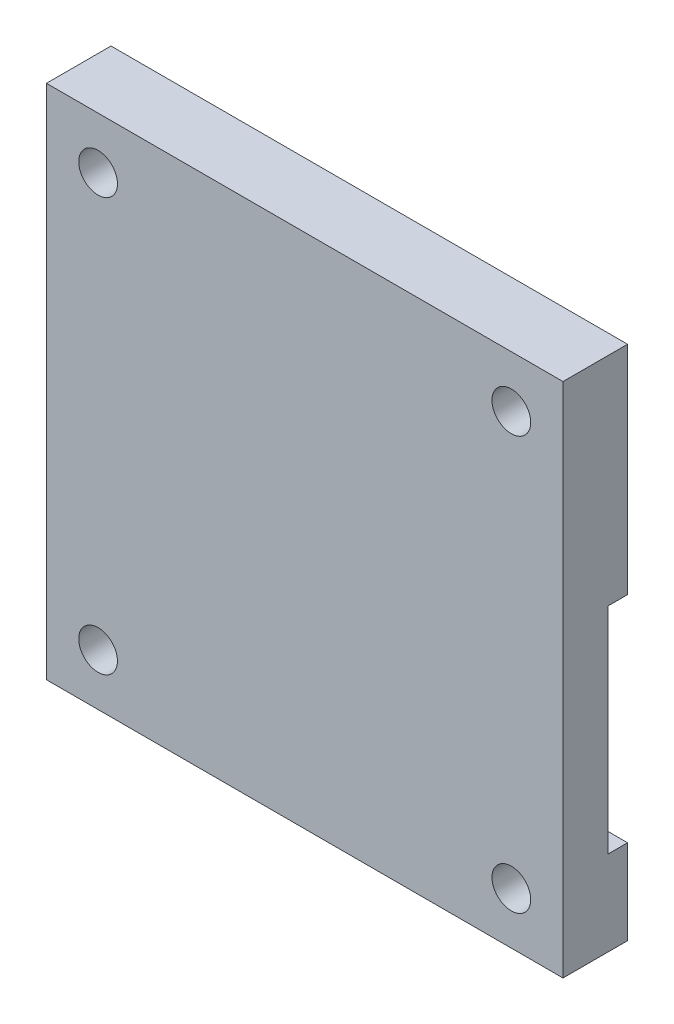
ISO-10303-21;
HEADER;
FILE_DESCRIPTION(('STEP AP214'),'2;1');
FILE_NAME('part.step','',(''),(''),'','','');
FILE_SCHEMA(('AUTOMOTIVE_DESIGN { 1 0 10303 214 1 1 1 1 }'));
ENDSEC;
DATA;
#1=APPLICATION_CONTEXT('core data for automotive mechanical design processes');
#2=APPLICATION_PROTOCOL_DEFINITION('international standard','automotive_design',2000,#1);
#3=PRODUCT_CONTEXT('',#1,'mechanical');
#4=PRODUCT('Part','Part','',(#3));
#5=PRODUCT_RELATED_PRODUCT_CATEGORY('part','',(#4));
#6=PRODUCT_DEFINITION_FORMATION('','',#4);
#7=PRODUCT_DEFINITION_CONTEXT('part definition',#1,'design');
#8=PRODUCT_DEFINITION('design','',#6,#7);
#9=PRODUCT_DEFINITION_SHAPE('','',#8);
#10=(LENGTH_UNIT() NAMED_UNIT(*) SI_UNIT(.MILLI.,.METRE.));
#11=(NAMED_UNIT(*) PLANE_ANGLE_UNIT() SI_UNIT($,.RADIAN.));
#12=(NAMED_UNIT(*) SI_UNIT($,.STERADIAN.) SOLID_ANGLE_UNIT());
#13=UNCERTAINTY_MEASURE_WITH_UNIT(LENGTH_MEASURE(1.E-05),#10,'distance_accuracy_value','');
#14=(GEOMETRIC_REPRESENTATION_CONTEXT(3) GLOBAL_UNCERTAINTY_ASSIGNED_CONTEXT((#13)) GLOBAL_UNIT_ASSIGNED_CONTEXT((#10,
#11,#12)) REPRESENTATION_CONTEXT('',''));
#15=CARTESIAN_POINT('',(0.,0.,0.));
#16=DIRECTION('',(0.,0.,1.));
#17=DIRECTION('',(1.,0.,0.));
#18=AXIS2_PLACEMENT_3D('',#15,#16,#17);
#19=CARTESIAN_POINT('',(0.,0.,0.));
#20=DIRECTION('',(0.,0.,1.));
#21=DIRECTION('',(1.,0.,0.));
#22=AXIS2_PLACEMENT_3D('',#19,#20,#21);
#23=PLANE('',#22);
#24=CARTESIAN_POINT('',(16.,16.,0.));
#25=DIRECTION('',(0.,0.,1.));
#26=DIRECTION('',(1.,0.,0.));
#27=AXIS2_PLACEMENT_3D('',#24,#25,#26);
#28=CIRCLE('',#27,1.5);
#29=CARTESIAN_POINT('',(17.5,16.,0.));
#30=VERTEX_POINT('',#29);
#31=EDGE_CURVE('E174',#30,#30,#28,.T.);
#32=ORIENTED_EDGE('',*,*,#31,.T.);
#33=EDGE_LOOP('',(#32));
#34=FACE_BOUND('',#33,.T.);
#35=CARTESIAN_POINT('',(-16.,16.,0.));
#36=DIRECTION('',(0.,0.,1.));
#37=DIRECTION('',(1.,0.,0.));
#38=AXIS2_PLACEMENT_3D('',#35,#36,#37);
#39=CIRCLE('',#38,1.5);
#40=CARTESIAN_POINT('',(-14.5,16.,0.));
#41=VERTEX_POINT('',#40);
#42=EDGE_CURVE('E182',#41,#41,#39,.T.);
#43=ORIENTED_EDGE('',*,*,#42,.T.);
#44=EDGE_LOOP('',(#43));
#45=FACE_BOUND('',#44,.T.);
#46=DIRECTION('',(0.,1.,0.));
#47=VECTOR('',#46,1.);
#48=CARTESIAN_POINT('',(20.,-20.,0.));
#49=LINE('',#48,#47);
#50=CARTESIAN_POINT('',(20.,3.20605328460744,0.));
#51=VERTEX_POINT('',#50);
#52=CARTESIAN_POINT('',(20.,20.,0.));
#53=VERTEX_POINT('',#52);
#54=EDGE_CURVE('E212',#51,#53,#49,.T.);
#55=ORIENTED_EDGE('',*,*,#54,.F.);
#56=DIRECTION('',(1.,0.,0.));
#57=VECTOR('',#56,1.);
#58=CARTESIAN_POINT('',(20.,3.20605328460744,0.));
#59=LINE('',#58,#57);
#60=CARTESIAN_POINT('',(-20.,3.20605328460744,0.));
#61=VERTEX_POINT('',#60);
#62=EDGE_CURVE('E142',#61,#51,#59,.T.);
#63=ORIENTED_EDGE('',*,*,#62,.F.);
#64=DIRECTION('',(0.,-1.,0.));
#65=VECTOR('',#64,1.);
#66=CARTESIAN_POINT('',(-20.,-20.,0.));
#67=LINE('',#66,#65);
#68=CARTESIAN_POINT('',(-20.,20.,0.));
#69=VERTEX_POINT('',#68);
#70=EDGE_CURVE('E205',#69,#61,#67,.T.);
#71=ORIENTED_EDGE('',*,*,#70,.F.);
#72=DIRECTION('',(-1.,0.,0.));
#73=VECTOR('',#72,1.);
#74=CARTESIAN_POINT('',(20.,20.,0.));
#75=LINE('',#74,#73);
#76=EDGE_CURVE('E90',#53,#69,#75,.T.);
#77=ORIENTED_EDGE('',*,*,#76,.F.);
#78=EDGE_LOOP('',(#55,#63,#71,#77));
#79=FACE_BOUND('',#78,.T.);
#80=ADVANCED_FACE('F39',(#34,#45,#79),#23,.F.);
#81=CARTESIAN_POINT('',(0.,0.,5.));
#82=DIRECTION('',(0.,0.,1.));
#83=DIRECTION('',(1.,0.,0.));
#84=AXIS2_PLACEMENT_3D('',#81,#82,#83);
#85=PLANE('',#84);
#86=CARTESIAN_POINT('',(-16.,-16.,5.));
#87=DIRECTION('',(0.,0.,1.));
#88=DIRECTION('',(1.,0.,0.));
#89=AXIS2_PLACEMENT_3D('',#86,#87,#88);
#90=CIRCLE('',#89,1.5);
#91=CARTESIAN_POINT('',(-14.5,-16.,5.));
#92=VERTEX_POINT('',#91);
#93=EDGE_CURVE('E170',#92,#92,#90,.T.);
#94=ORIENTED_EDGE('',*,*,#93,.F.);
#95=EDGE_LOOP('',(#94));
#96=FACE_BOUND('',#95,.T.);
#97=CARTESIAN_POINT('',(-16.,16.,5.));
#98=DIRECTION('',(0.,0.,1.));
#99=DIRECTION('',(1.,0.,0.));
#100=AXIS2_PLACEMENT_3D('',#97,#98,#99);
#101=CIRCLE('',#100,1.5);
#102=CARTESIAN_POINT('',(-14.5,16.,5.));
#103=VERTEX_POINT('',#102);
#104=EDGE_CURVE('E186',#103,#103,#101,.T.);
#105=ORIENTED_EDGE('',*,*,#104,.F.);
#106=EDGE_LOOP('',(#105));
#107=FACE_BOUND('',#106,.T.);
#108=DIRECTION('',(0.,-1.,0.));
#109=VECTOR('',#108,1.);
#110=CARTESIAN_POINT('',(-20.,-20.,5.));
#111=LINE('',#110,#109);
#112=CARTESIAN_POINT('',(-20.,20.,5.));
#113=VERTEX_POINT('',#112);
#114=CARTESIAN_POINT('',(-20.,-20.,5.));
#115=VERTEX_POINT('',#114);
#116=EDGE_CURVE('E194',#113,#115,#111,.T.);
#117=ORIENTED_EDGE('',*,*,#116,.T.);
#118=DIRECTION('',(1.,0.,0.));
#119=VECTOR('',#118,1.);
#120=CARTESIAN_POINT('',(20.,-20.,5.));
#121=LINE('',#120,#119);
#122=CARTESIAN_POINT('',(20.,-20.,5.));
#123=VERTEX_POINT('',#122);
#124=EDGE_CURVE('E97',#115,#123,#121,.T.);
#125=ORIENTED_EDGE('',*,*,#124,.T.);
#126=DIRECTION('',(0.,1.,0.));
#127=VECTOR('',#126,1.);
#128=CARTESIAN_POINT('',(20.,-20.,5.));
#129=LINE('',#128,#127);
#130=CARTESIAN_POINT('',(20.,20.,5.));
#131=VERTEX_POINT('',#130);
#132=EDGE_CURVE('E199',#123,#131,#129,.T.);
#133=ORIENTED_EDGE('',*,*,#132,.T.);
#134=DIRECTION('',(-1.,0.,0.));
#135=VECTOR('',#134,1.);
#136=CARTESIAN_POINT('',(20.,20.,5.));
#137=LINE('',#136,#135);
#138=EDGE_CURVE('E66',#131,#113,#137,.T.);
#139=ORIENTED_EDGE('',*,*,#138,.T.);
#140=EDGE_LOOP('',(#117,#125,#133,#139));
#141=FACE_BOUND('',#140,.T.);
#142=CARTESIAN_POINT('',(16.,16.,5.));
#143=DIRECTION('',(0.,0.,1.));
#144=DIRECTION('',(1.,0.,0.));
#145=AXIS2_PLACEMENT_3D('',#142,#143,#144);
#146=CIRCLE('',#145,1.5);
#147=CARTESIAN_POINT('',(17.5,16.,5.));
#148=VERTEX_POINT('',#147);
#149=EDGE_CURVE('E178',#148,#148,#146,.T.);
#150=ORIENTED_EDGE('',*,*,#149,.F.);
#151=EDGE_LOOP('',(#150));
#152=FACE_BOUND('',#151,.T.);
#153=CARTESIAN_POINT('',(16.,-16.,5.));
#154=DIRECTION('',(0.,0.,1.));
#155=DIRECTION('',(1.,0.,0.));
#156=AXIS2_PLACEMENT_3D('',#153,#154,#155);
#157=CIRCLE('',#156,1.5);
#158=CARTESIAN_POINT('',(17.5,-16.,5.));
#159=VERTEX_POINT('',#158);
#160=EDGE_CURVE('E160',#159,#159,#157,.T.);
#161=ORIENTED_EDGE('',*,*,#160,.F.);
#162=EDGE_LOOP('',(#161));
#163=FACE_BOUND('',#162,.T.);
#164=ADVANCED_FACE('F257',(#96,#107,#141,#152,#163),#85,.T.);
#165=CARTESIAN_POINT('',(-20.,-13.4300084191565,0.));
#166=VERTEX_POINT('',#165);
#167=CARTESIAN_POINT('',(-20.,-20.,0.));
#168=VERTEX_POINT('',#167);
#169=EDGE_CURVE('E190',#166,#168,#67,.T.);
#170=ORIENTED_EDGE('',*,*,#169,.F.);
#171=DIRECTION('',(-1.,0.,0.));
#172=VECTOR('',#171,1.);
#173=CARTESIAN_POINT('',(20.,-13.4300084191565,0.));
#174=LINE('',#173,#172);
#175=CARTESIAN_POINT('',(20.,-13.4300084191565,0.));
#176=VERTEX_POINT('',#175);
#177=EDGE_CURVE('E226',#176,#166,#174,.T.);
#178=ORIENTED_EDGE('',*,*,#177,.F.);
#179=CARTESIAN_POINT('',(20.,-20.,0.));
#180=VERTEX_POINT('',#179);
#181=EDGE_CURVE('E148',#180,#176,#49,.T.);
#182=ORIENTED_EDGE('',*,*,#181,.F.);
#183=DIRECTION('',(1.,0.,0.));
#184=VECTOR('',#183,1.);
#185=CARTESIAN_POINT('',(20.,-20.,0.));
#186=LINE('',#185,#184);
#187=EDGE_CURVE('E209',#168,#180,#186,.T.);
#188=ORIENTED_EDGE('',*,*,#187,.F.);
#189=EDGE_LOOP('',(#170,#178,#182,#188));
#190=FACE_BOUND('',#189,.T.);
#191=CARTESIAN_POINT('',(-16.,-16.,0.));
#192=DIRECTION('',(0.,0.,1.));
#193=DIRECTION('',(1.,0.,0.));
#194=AXIS2_PLACEMENT_3D('',#191,#192,#193);
#195=CIRCLE('',#194,1.5);
#196=CARTESIAN_POINT('',(-14.5,-16.,0.));
#197=VERTEX_POINT('',#196);
#198=EDGE_CURVE('E164',#197,#197,#195,.T.);
#199=ORIENTED_EDGE('',*,*,#198,.T.);
#200=EDGE_LOOP('',(#199));
#201=FACE_BOUND('',#200,.T.);
#202=CARTESIAN_POINT('',(16.,-16.,0.));
#203=DIRECTION('',(0.,0.,1.));
#204=DIRECTION('',(1.,0.,0.));
#205=AXIS2_PLACEMENT_3D('',#202,#203,#204);
#206=CIRCLE('',#205,1.5);
#207=CARTESIAN_POINT('',(17.5,-16.,0.));
#208=VERTEX_POINT('',#207);
#209=EDGE_CURVE('E165',#208,#208,#206,.T.);
#210=ORIENTED_EDGE('',*,*,#209,.T.);
#211=EDGE_LOOP('',(#210));
#212=FACE_BOUND('',#211,.T.);
#213=ADVANCED_FACE('F224',(#190,#201,#212),#23,.F.);
#214=CARTESIAN_POINT('',(-20.,-20.,5.));
#215=DIRECTION('',(1.,0.,0.));
#216=DIRECTION('',(0.,1.,0.));
#217=AXIS2_PLACEMENT_3D('',#214,#215,#216);
#218=PLANE('',#217);
#219=ORIENTED_EDGE('',*,*,#70,.T.);
#220=DIRECTION('',(0.,0.,-1.));
#221=VECTOR('',#220,1.);
#222=CARTESIAN_POINT('',(-20.,3.20605328460744,1.5));
#223=LINE('',#222,#221);
#224=CARTESIAN_POINT('',(-20.,3.20605328460744,1.5));
#225=VERTEX_POINT('',#224);
#226=EDGE_CURVE('E154',#225,#61,#223,.T.);
#227=ORIENTED_EDGE('',*,*,#226,.F.);
#228=DIRECTION('',(0.,1.,0.));
#229=VECTOR('',#228,1.);
#230=CARTESIAN_POINT('',(-20.,-13.4300084191565,1.5));
#231=LINE('',#230,#229);
#232=CARTESIAN_POINT('',(-20.,-13.4300084191565,1.5));
#233=VERTEX_POINT('',#232);
#234=EDGE_CURVE('E134',#233,#225,#231,.T.);
#235=ORIENTED_EDGE('',*,*,#234,.F.);
#236=DIRECTION('',(0.,0.,-1.));
#237=VECTOR('',#236,1.);
#238=CARTESIAN_POINT('',(-20.,-13.4300084191565,1.5));
#239=LINE('',#238,#237);
#240=EDGE_CURVE('E131',#233,#166,#239,.T.);
#241=ORIENTED_EDGE('',*,*,#240,.T.);
#242=ORIENTED_EDGE('',*,*,#169,.T.);
#243=DIRECTION('',(0.,0.,-1.));
#244=VECTOR('',#243,1.);
#245=CARTESIAN_POINT('',(-20.,-20.,5.));
#246=LINE('',#245,#244);
#247=EDGE_CURVE('E11',#115,#168,#246,.T.);
#248=ORIENTED_EDGE('',*,*,#247,.F.);
#249=ORIENTED_EDGE('',*,*,#116,.F.);
#250=DIRECTION('',(0.,0.,-1.));
#251=VECTOR('',#250,1.);
#252=CARTESIAN_POINT('',(-20.,20.,5.));
#253=LINE('',#252,#251);
#254=EDGE_CURVE('E204',#113,#69,#253,.T.);
#255=ORIENTED_EDGE('',*,*,#254,.T.);
#256=EDGE_LOOP('',(#219,#227,#235,#241,#242,#248,#249,#255));
#257=FACE_BOUND('',#256,.T.);
#258=ADVANCED_FACE('F41',(#257),#218,.F.);
#259=CARTESIAN_POINT('',(20.,-20.,5.));
#260=DIRECTION('',(0.,1.,0.));
#261=DIRECTION('',(0.,0.,1.));
#262=AXIS2_PLACEMENT_3D('',#259,#260,#261);
#263=PLANE('',#262);
#264=ORIENTED_EDGE('',*,*,#187,.T.);
#265=DIRECTION('',(0.,0.,-1.));
#266=VECTOR('',#265,1.);
#267=CARTESIAN_POINT('',(20.,-20.,5.));
#268=LINE('',#267,#266);
#269=EDGE_CURVE('E47',#123,#180,#268,.T.);
#270=ORIENTED_EDGE('',*,*,#269,.F.);
#271=ORIENTED_EDGE('',*,*,#124,.F.);
#272=ORIENTED_EDGE('',*,*,#247,.T.);
#273=EDGE_LOOP('',(#264,#270,#271,#272));
#274=FACE_BOUND('',#273,.T.);
#275=ADVANCED_FACE('F249',(#274),#263,.F.);
#276=CARTESIAN_POINT('',(20.,-20.,5.));
#277=DIRECTION('',(-1.,0.,0.));
#278=DIRECTION('',(0.,0.,1.));
#279=AXIS2_PLACEMENT_3D('',#276,#277,#278);
#280=PLANE('',#279);
#281=DIRECTION('',(0.,-1.,0.));
#282=VECTOR('',#281,1.);
#283=CARTESIAN_POINT('',(20.,-13.4300084191565,1.5));
#284=LINE('',#283,#282);
#285=CARTESIAN_POINT('',(20.,3.20605328460744,1.5));
#286=VERTEX_POINT('',#285);
#287=CARTESIAN_POINT('',(20.,-13.4300084191565,1.5));
#288=VERTEX_POINT('',#287);
#289=EDGE_CURVE('E135',#286,#288,#284,.T.);
#290=ORIENTED_EDGE('',*,*,#289,.F.);
#291=DIRECTION('',(0.,0.,-1.));
#292=VECTOR('',#291,1.);
#293=CARTESIAN_POINT('',(20.,3.20605328460744,1.5));
#294=LINE('',#293,#292);
#295=EDGE_CURVE('E169',#286,#51,#294,.T.);
#296=ORIENTED_EDGE('',*,*,#295,.T.);
#297=ORIENTED_EDGE('',*,*,#54,.T.);
#298=DIRECTION('',(0.,0.,-1.));
#299=VECTOR('',#298,1.);
#300=CARTESIAN_POINT('',(20.,20.,5.));
#301=LINE('',#300,#299);
#302=EDGE_CURVE('E217',#131,#53,#301,.T.);
#303=ORIENTED_EDGE('',*,*,#302,.F.);
#304=ORIENTED_EDGE('',*,*,#132,.F.);
#305=ORIENTED_EDGE('',*,*,#269,.T.);
#306=ORIENTED_EDGE('',*,*,#181,.T.);
#307=DIRECTION('',(0.,0.,-1.));
#308=VECTOR('',#307,1.);
#309=CARTESIAN_POINT('',(20.,-13.4300084191565,1.5));
#310=LINE('',#309,#308);
#311=EDGE_CURVE('E128',#288,#176,#310,.T.);
#312=ORIENTED_EDGE('',*,*,#311,.F.);
#313=EDGE_LOOP('',(#290,#296,#297,#303,#304,#305,#306,#312));
#314=FACE_BOUND('',#313,.T.);
#315=ADVANCED_FACE('F145',(#314),#280,.F.);
#316=CARTESIAN_POINT('',(20.,20.,5.));
#317=DIRECTION('',(0.,-1.,0.));
#318=DIRECTION('',(1.,0.,0.));
#319=AXIS2_PLACEMENT_3D('',#316,#317,#318);
#320=PLANE('',#319);
#321=ORIENTED_EDGE('',*,*,#76,.T.);
#322=ORIENTED_EDGE('',*,*,#254,.F.);
#323=ORIENTED_EDGE('',*,*,#138,.F.);
#324=ORIENTED_EDGE('',*,*,#302,.T.);
#325=EDGE_LOOP('',(#321,#322,#323,#324));
#326=FACE_BOUND('',#325,.T.);
#327=ADVANCED_FACE('F245',(#326),#320,.F.);
#328=CARTESIAN_POINT('',(-16.,16.,5.));
#329=DIRECTION('',(0.,0.,-1.));
#330=DIRECTION('',(-1.,0.,0.));
#331=AXIS2_PLACEMENT_3D('',#328,#329,#330);
#332=CYLINDRICAL_SURFACE('',#331,1.5);
#333=ORIENTED_EDGE('',*,*,#104,.T.);
#334=EDGE_LOOP('',(#333));
#335=FACE_BOUND('',#334,.T.);
#336=ORIENTED_EDGE('',*,*,#42,.F.);
#337=EDGE_LOOP('',(#336));
#338=FACE_BOUND('',#337,.T.);
#339=ADVANCED_FACE('F292',(#335,#338),#332,.F.);
#340=CARTESIAN_POINT('',(16.,16.,5.));
#341=DIRECTION('',(0.,0.,-1.));
#342=DIRECTION('',(-1.,0.,0.));
#343=AXIS2_PLACEMENT_3D('',#340,#341,#342);
#344=CYLINDRICAL_SURFACE('',#343,1.5);
#345=ORIENTED_EDGE('',*,*,#149,.T.);
#346=EDGE_LOOP('',(#345));
#347=FACE_BOUND('',#346,.T.);
#348=ORIENTED_EDGE('',*,*,#31,.F.);
#349=EDGE_LOOP('',(#348));
#350=FACE_BOUND('',#349,.T.);
#351=ADVANCED_FACE('F298',(#347,#350),#344,.F.);
#352=CARTESIAN_POINT('',(-16.,-16.,5.));
#353=DIRECTION('',(0.,0.,-1.));
#354=DIRECTION('',(-1.,0.,0.));
#355=AXIS2_PLACEMENT_3D('',#352,#353,#354);
#356=CYLINDRICAL_SURFACE('',#355,1.5);
#357=ORIENTED_EDGE('',*,*,#93,.T.);
#358=EDGE_LOOP('',(#357));
#359=FACE_BOUND('',#358,.T.);
#360=ORIENTED_EDGE('',*,*,#198,.F.);
#361=EDGE_LOOP('',(#360));
#362=FACE_BOUND('',#361,.T.);
#363=ADVANCED_FACE('F306',(#359,#362),#356,.F.);
#364=CARTESIAN_POINT('',(16.,-16.,5.));
#365=DIRECTION('',(0.,0.,-1.));
#366=DIRECTION('',(-1.,0.,0.));
#367=AXIS2_PLACEMENT_3D('',#364,#365,#366);
#368=CYLINDRICAL_SURFACE('',#367,1.5);
#369=ORIENTED_EDGE('',*,*,#160,.T.);
#370=EDGE_LOOP('',(#369));
#371=FACE_BOUND('',#370,.T.);
#372=ORIENTED_EDGE('',*,*,#209,.F.);
#373=EDGE_LOOP('',(#372));
#374=FACE_BOUND('',#373,.T.);
#375=ADVANCED_FACE('F314',(#371,#374),#368,.F.);
#376=CARTESIAN_POINT('',(20.,3.20605328460744,1.5));
#377=DIRECTION('',(0.,1.,0.));
#378=DIRECTION('',(0.,0.,1.));
#379=AXIS2_PLACEMENT_3D('',#376,#377,#378);
#380=PLANE('',#379);
#381=ORIENTED_EDGE('',*,*,#62,.T.);
#382=ORIENTED_EDGE('',*,*,#295,.F.);
#383=DIRECTION('',(1.,0.,0.));
#384=VECTOR('',#383,1.);
#385=CARTESIAN_POINT('',(20.,3.20605328460744,1.5));
#386=LINE('',#385,#384);
#387=EDGE_CURVE('E57',#225,#286,#386,.T.);
#388=ORIENTED_EDGE('',*,*,#387,.F.);
#389=ORIENTED_EDGE('',*,*,#226,.T.);
#390=EDGE_LOOP('',(#381,#382,#388,#389));
#391=FACE_BOUND('',#390,.T.);
#392=ADVANCED_FACE('F238',(#391),#380,.F.);
#393=CARTESIAN_POINT('',(20.,-13.4300084191565,1.5));
#394=DIRECTION('',(0.,-1.,0.));
#395=DIRECTION('',(0.,0.,-1.));
#396=AXIS2_PLACEMENT_3D('',#393,#394,#395);
#397=PLANE('',#396);
#398=ORIENTED_EDGE('',*,*,#177,.T.);
#399=ORIENTED_EDGE('',*,*,#240,.F.);
#400=DIRECTION('',(-1.,0.,0.));
#401=VECTOR('',#400,1.);
#402=CARTESIAN_POINT('',(20.,-13.4300084191565,1.5));
#403=LINE('',#402,#401);
#404=EDGE_CURVE('E125',#288,#233,#403,.T.);
#405=ORIENTED_EDGE('',*,*,#404,.F.);
#406=ORIENTED_EDGE('',*,*,#311,.T.);
#407=EDGE_LOOP('',(#398,#399,#405,#406));
#408=FACE_BOUND('',#407,.T.);
#409=ADVANCED_FACE('F126',(#408),#397,.F.);
#410=CARTESIAN_POINT('',(0.,0.,1.5));
#411=DIRECTION('',(0.,0.,1.));
#412=DIRECTION('',(1.,0.,0.));
#413=AXIS2_PLACEMENT_3D('',#410,#411,#412);
#414=PLANE('',#413);
#415=ORIENTED_EDGE('',*,*,#289,.T.);
#416=ORIENTED_EDGE('',*,*,#404,.T.);
#417=ORIENTED_EDGE('',*,*,#234,.T.);
#418=ORIENTED_EDGE('',*,*,#387,.T.);
#419=EDGE_LOOP('',(#415,#416,#417,#418));
#420=FACE_BOUND('',#419,.T.);
#421=ADVANCED_FACE('F138',(#420),#414,.F.);
#422=CLOSED_SHELL('',(#80,#164,#213,#258,#275,#315,#327,#339,#351,#363,#375,#392,#409,#421));
#423=MANIFOLD_SOLID_BREP('B2',#422);
#424=ADVANCED_BREP_SHAPE_REPRESENTATION('',(#18,#423),#14);
#425=SHAPE_DEFINITION_REPRESENTATION(#9,#424);
ENDSEC;
END-ISO-10303-21;
